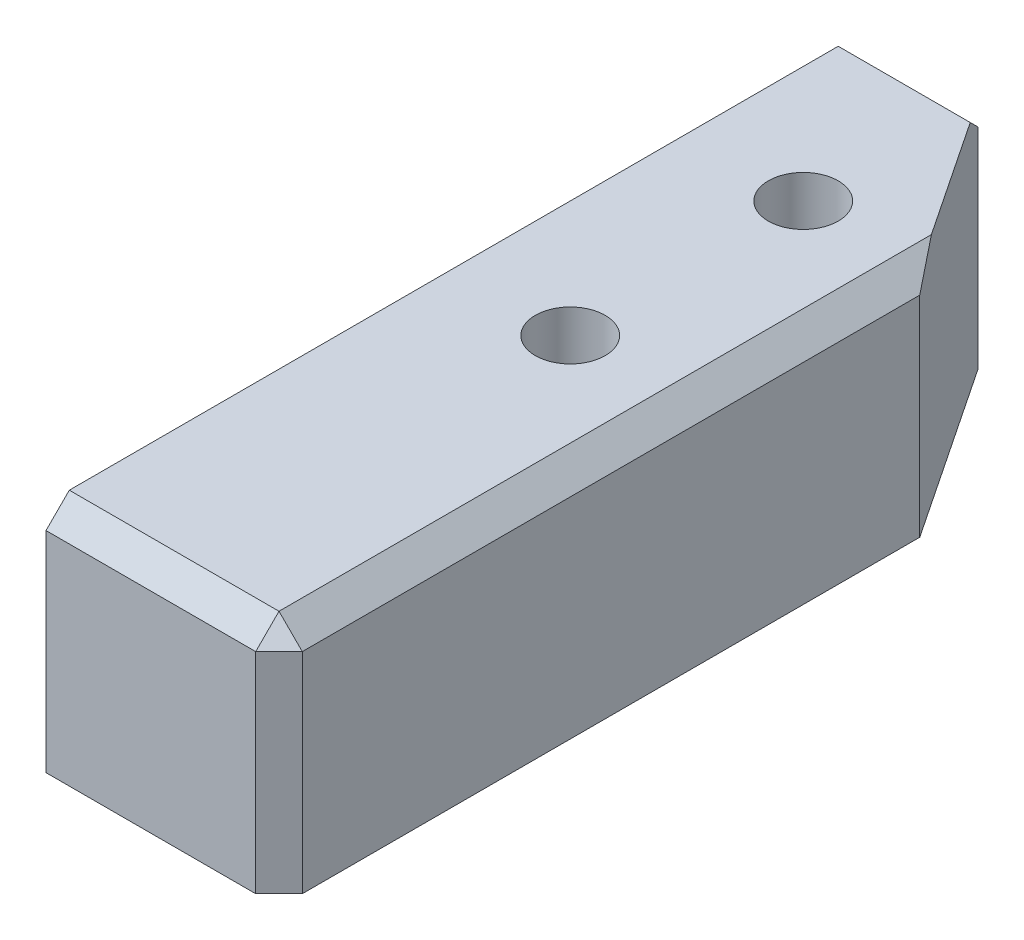
ISO-10303-21;
HEADER;
FILE_DESCRIPTION(('STEP AP214'),'2;1');
FILE_NAME('part.step','',(''),(''),'','','');
FILE_SCHEMA(('AUTOMOTIVE_DESIGN { 1 0 10303 214 1 1 1 1 }'));
ENDSEC;
DATA;
#1=APPLICATION_CONTEXT('core data for automotive mechanical design processes');
#2=APPLICATION_PROTOCOL_DEFINITION('international standard','automotive_design',2000,#1);
#3=PRODUCT_CONTEXT('',#1,'mechanical');
#4=PRODUCT('Part','Part','',(#3));
#5=PRODUCT_RELATED_PRODUCT_CATEGORY('part','',(#4));
#6=PRODUCT_DEFINITION_FORMATION('','',#4);
#7=PRODUCT_DEFINITION_CONTEXT('part definition',#1,'design');
#8=PRODUCT_DEFINITION('design','',#6,#7);
#9=PRODUCT_DEFINITION_SHAPE('','',#8);
#10=(LENGTH_UNIT() NAMED_UNIT(*) SI_UNIT(.MILLI.,.METRE.));
#11=(NAMED_UNIT(*) PLANE_ANGLE_UNIT() SI_UNIT($,.RADIAN.));
#12=(NAMED_UNIT(*) SI_UNIT($,.STERADIAN.) SOLID_ANGLE_UNIT());
#13=UNCERTAINTY_MEASURE_WITH_UNIT(LENGTH_MEASURE(1.E-05),#10,'distance_accuracy_value','');
#14=(GEOMETRIC_REPRESENTATION_CONTEXT(3) GLOBAL_UNCERTAINTY_ASSIGNED_CONTEXT((#13)) GLOBAL_UNIT_ASSIGNED_CONTEXT((#10,
#11,#12)) REPRESENTATION_CONTEXT('',''));
#15=CARTESIAN_POINT('',(0.,0.,0.));
#16=DIRECTION('',(0.,0.,1.));
#17=DIRECTION('',(1.,0.,0.));
#18=AXIS2_PLACEMENT_3D('',#15,#16,#17);
#19=CARTESIAN_POINT('',(-5.,10.,22.5));
#20=DIRECTION('',(1.,0.,0.));
#21=DIRECTION('',(0.,0.,-1.));
#22=AXIS2_PLACEMENT_3D('',#19,#20,#21);
#23=PLANE('',#22);
#24=DIRECTION('',(0.,0.,1.));
#25=VECTOR('',#24,1.);
#26=CARTESIAN_POINT('',(-5.,10.,22.5));
#27=LINE('',#26,#25);
#28=CARTESIAN_POINT('',(-5.,10.,-11.5));
#29=VERTEX_POINT('',#28);
#30=CARTESIAN_POINT('',(-5.,10.,21.5));
#31=VERTEX_POINT('',#30);
#32=EDGE_CURVE('E135',#29,#31,#27,.T.);
#33=ORIENTED_EDGE('',*,*,#32,.F.);
#34=DIRECTION('',(0.,-0.707106781186548,-0.707106781186548));
#35=VECTOR('',#34,1.);
#36=CARTESIAN_POINT('',(-5.,10.,-11.5));
#37=LINE('',#36,#35);
#38=CARTESIAN_POINT('',(-5.,9.,-12.5));
#39=VERTEX_POINT('',#38);
#40=EDGE_CURVE('E165',#29,#39,#37,.T.);
#41=ORIENTED_EDGE('',*,*,#40,.T.);
#42=DIRECTION('',(0.,-1.,0.));
#43=VECTOR('',#42,1.);
#44=CARTESIAN_POINT('',(-5.,10.,-12.5));
#45=LINE('',#44,#43);
#46=CARTESIAN_POINT('',(-5.,0.,-12.5));
#47=VERTEX_POINT('',#46);
#48=EDGE_CURVE('E141',#39,#47,#45,.T.);
#49=ORIENTED_EDGE('',*,*,#48,.T.);
#50=DIRECTION('',(0.,0.,1.));
#51=VECTOR('',#50,1.);
#52=CARTESIAN_POINT('',(-5.,0.,22.5));
#53=LINE('',#52,#51);
#54=CARTESIAN_POINT('',(-5.,0.,22.5));
#55=VERTEX_POINT('',#54);
#56=EDGE_CURVE('E133',#47,#55,#53,.T.);
#57=ORIENTED_EDGE('',*,*,#56,.T.);
#58=DIRECTION('',(0.,-1.,0.));
#59=VECTOR('',#58,1.);
#60=CARTESIAN_POINT('',(-5.,10.,22.5));
#61=LINE('',#60,#59);
#62=CARTESIAN_POINT('',(-5.,8.99999999999999,22.5));
#63=VERTEX_POINT('',#62);
#64=EDGE_CURVE('E149',#63,#55,#61,.T.);
#65=ORIENTED_EDGE('',*,*,#64,.F.);
#66=DIRECTION('',(0.,0.707106781186549,-0.707106781186546));
#67=VECTOR('',#66,1.);
#68=CARTESIAN_POINT('',(-5.,10.,21.5));
#69=LINE('',#68,#67);
#70=EDGE_CURVE('E162',#63,#31,#69,.T.);
#71=ORIENTED_EDGE('',*,*,#70,.T.);
#72=EDGE_LOOP('',(#33,#41,#49,#57,#65,#71));
#73=FACE_BOUND('',#72,.T.);
#74=ADVANCED_FACE('F39',(#73),#23,.F.);
#75=CARTESIAN_POINT('',(5.,10.,22.5));
#76=DIRECTION('',(0.,0.,-1.));
#77=DIRECTION('',(-1.,0.,0.));
#78=AXIS2_PLACEMENT_3D('',#75,#76,#77);
#79=PLANE('',#78);
#80=DIRECTION('',(1.,0.,0.));
#81=VECTOR('',#80,1.);
#82=CARTESIAN_POINT('',(5.,0.,22.5));
#83=LINE('',#82,#81);
#84=CARTESIAN_POINT('',(3.99999999999999,0.,22.5));
#85=VERTEX_POINT('',#84);
#86=EDGE_CURVE('E143',#55,#85,#83,.T.);
#87=ORIENTED_EDGE('',*,*,#86,.T.);
#88=DIRECTION('',(0.,1.,0.));
#89=VECTOR('',#88,1.);
#90=CARTESIAN_POINT('',(3.99999999999999,10.,22.5));
#91=LINE('',#90,#89);
#92=CARTESIAN_POINT('',(3.99999999999999,8.99999999999999,22.5));
#93=VERTEX_POINT('',#92);
#94=EDGE_CURVE('E11',#85,#93,#91,.T.);
#95=ORIENTED_EDGE('',*,*,#94,.T.);
#96=DIRECTION('',(-1.,0.,0.));
#97=VECTOR('',#96,1.);
#98=CARTESIAN_POINT('',(-5.,8.99999999999999,22.5));
#99=LINE('',#98,#97);
#100=EDGE_CURVE('E49',#93,#63,#99,.T.);
#101=ORIENTED_EDGE('',*,*,#100,.T.);
#102=ORIENTED_EDGE('',*,*,#64,.T.);
#103=EDGE_LOOP('',(#87,#95,#101,#102));
#104=FACE_BOUND('',#103,.T.);
#105=ADVANCED_FACE('F225',(#104),#79,.F.);
#106=CARTESIAN_POINT('',(5.,10.,22.5));
#107=DIRECTION('',(-1.,0.,0.));
#108=DIRECTION('',(0.,0.,1.));
#109=AXIS2_PLACEMENT_3D('',#106,#107,#108);
#110=PLANE('',#109);
#111=DIRECTION('',(0.,0.,1.));
#112=VECTOR('',#111,1.);
#113=CARTESIAN_POINT('',(5.,8.99999999999999,22.5));
#114=LINE('',#113,#112);
#115=CARTESIAN_POINT('',(5.,8.99999999999999,-5.));
#116=VERTEX_POINT('',#115);
#117=CARTESIAN_POINT('',(5.,8.99999999999999,21.5));
#118=VERTEX_POINT('',#117);
#119=EDGE_CURVE('E176',#116,#118,#114,.T.);
#120=ORIENTED_EDGE('',*,*,#119,.T.);
#121=DIRECTION('',(0.,-1.,0.));
#122=VECTOR('',#121,1.);
#123=CARTESIAN_POINT('',(5.,10.,21.5));
#124=LINE('',#123,#122);
#125=CARTESIAN_POINT('',(5.,0.,21.5));
#126=VERTEX_POINT('',#125);
#127=EDGE_CURVE('E179',#118,#126,#124,.T.);
#128=ORIENTED_EDGE('',*,*,#127,.T.);
#129=DIRECTION('',(0.,0.,-1.));
#130=VECTOR('',#129,1.);
#131=CARTESIAN_POINT('',(5.,0.,22.5));
#132=LINE('',#131,#130);
#133=CARTESIAN_POINT('',(5.,0.,-5.00000000000001));
#134=VERTEX_POINT('',#133);
#135=EDGE_CURVE('E136',#126,#134,#132,.T.);
#136=ORIENTED_EDGE('',*,*,#135,.T.);
#137=DIRECTION('',(0.,1.,0.));
#138=VECTOR('',#137,1.);
#139=CARTESIAN_POINT('',(5.,0.,-5.));
#140=LINE('',#139,#138);
#141=EDGE_CURVE('E116',#134,#116,#140,.T.);
#142=ORIENTED_EDGE('',*,*,#141,.T.);
#143=EDGE_LOOP('',(#120,#128,#136,#142));
#144=FACE_BOUND('',#143,.T.);
#145=ADVANCED_FACE('F246',(#144),#110,.F.);
#146=CARTESIAN_POINT('',(5.,10.,-12.5));
#147=DIRECTION('',(0.,0.,1.));
#148=DIRECTION('',(1.,0.,0.));
#149=AXIS2_PLACEMENT_3D('',#146,#147,#148);
#150=PLANE('',#149);
#151=ORIENTED_EDGE('',*,*,#48,.F.);
#152=DIRECTION('',(1.,0.,0.));
#153=VECTOR('',#152,1.);
#154=CARTESIAN_POINT('',(0.,9.,-12.5));
#155=LINE('',#154,#153);
#156=CARTESIAN_POINT('',(0.,9.,-12.5));
#157=VERTEX_POINT('',#156);
#158=EDGE_CURVE('E128',#39,#157,#155,.T.);
#159=ORIENTED_EDGE('',*,*,#158,.T.);
#160=DIRECTION('',(0.,1.,0.));
#161=VECTOR('',#160,1.);
#162=CARTESIAN_POINT('',(0.,0.,-12.5));
#163=LINE('',#162,#161);
#164=CARTESIAN_POINT('',(0.,0.,-12.5));
#165=VERTEX_POINT('',#164);
#166=EDGE_CURVE('E113',#165,#157,#163,.T.);
#167=ORIENTED_EDGE('',*,*,#166,.F.);
#168=DIRECTION('',(-1.,0.,0.));
#169=VECTOR('',#168,1.);
#170=CARTESIAN_POINT('',(5.,0.,-12.5));
#171=LINE('',#170,#169);
#172=EDGE_CURVE('E125',#165,#47,#171,.T.);
#173=ORIENTED_EDGE('',*,*,#172,.T.);
#174=EDGE_LOOP('',(#151,#159,#167,#173));
#175=FACE_BOUND('',#174,.T.);
#176=ADVANCED_FACE('F124',(#175),#150,.F.);
#177=CARTESIAN_POINT('',(0.,10.,0.));
#178=DIRECTION('',(0.,1.,0.));
#179=DIRECTION('',(0.,0.,1.));
#180=AXIS2_PLACEMENT_3D('',#177,#178,#179);
#181=PLANE('',#180);
#182=DIRECTION('',(0.554700196225229,0.,0.832050294337844));
#183=VECTOR('',#182,1.);
#184=CARTESIAN_POINT('',(0.,10.,-12.5));
#185=LINE('',#184,#183);
#186=CARTESIAN_POINT('',(0.666666666666669,10.,-11.5));
#187=VERTEX_POINT('',#186);
#188=CARTESIAN_POINT('',(4.,10.,-6.50000000000001));
#189=VERTEX_POINT('',#188);
#190=EDGE_CURVE('E119',#187,#189,#185,.T.);
#191=ORIENTED_EDGE('',*,*,#190,.F.);
#192=DIRECTION('',(-1.,0.,0.));
#193=VECTOR('',#192,1.);
#194=CARTESIAN_POINT('',(-5.,10.,-11.5));
#195=LINE('',#194,#193);
#196=EDGE_CURVE('E158',#187,#29,#195,.T.);
#197=ORIENTED_EDGE('',*,*,#196,.T.);
#198=ORIENTED_EDGE('',*,*,#32,.T.);
#199=DIRECTION('',(1.,0.,0.));
#200=VECTOR('',#199,1.);
#201=CARTESIAN_POINT('',(5.,10.,21.5));
#202=LINE('',#201,#200);
#203=CARTESIAN_POINT('',(4.,10.,21.5));
#204=VERTEX_POINT('',#203);
#205=EDGE_CURVE('E152',#31,#204,#202,.T.);
#206=ORIENTED_EDGE('',*,*,#205,.T.);
#207=DIRECTION('',(0.,0.,-1.));
#208=VECTOR('',#207,1.);
#209=CARTESIAN_POINT('',(4.,10.,-5.));
#210=LINE('',#209,#208);
#211=EDGE_CURVE('E155',#204,#189,#210,.T.);
#212=ORIENTED_EDGE('',*,*,#211,.T.);
#213=EDGE_LOOP('',(#191,#197,#198,#206,#212));
#214=FACE_BOUND('',#213,.T.);
#215=CARTESIAN_POINT('',(0.,10.,-5.));
#216=DIRECTION('',(0.,1.,0.));
#217=DIRECTION('',(0.,0.,1.));
#218=AXIS2_PLACEMENT_3D('',#215,#216,#217);
#219=CIRCLE('',#218,1.5);
#220=CARTESIAN_POINT('',(0.,10.,-3.5));
#221=VERTEX_POINT('',#220);
#222=EDGE_CURVE('E212',#221,#221,#219,.T.);
#223=ORIENTED_EDGE('',*,*,#222,.F.);
#224=EDGE_LOOP('',(#223));
#225=FACE_BOUND('',#224,.T.);
#226=CARTESIAN_POINT('',(0.,10.,5.));
#227=DIRECTION('',(0.,1.,0.));
#228=DIRECTION('',(0.,0.,1.));
#229=AXIS2_PLACEMENT_3D('',#226,#227,#228);
#230=CIRCLE('',#229,1.5);
#231=CARTESIAN_POINT('',(0.,10.,6.5));
#232=VERTEX_POINT('',#231);
#233=EDGE_CURVE('E206',#232,#232,#230,.T.);
#234=ORIENTED_EDGE('',*,*,#233,.F.);
#235=EDGE_LOOP('',(#234));
#236=FACE_BOUND('',#235,.T.);
#237=ADVANCED_FACE('F263',(#214,#225,#236),#181,.T.);
#238=CARTESIAN_POINT('',(0.,0.,0.));
#239=DIRECTION('',(0.,1.,0.));
#240=DIRECTION('',(0.,0.,1.));
#241=AXIS2_PLACEMENT_3D('',#238,#239,#240);
#242=PLANE('',#241);
#243=CARTESIAN_POINT('',(0.,0.,-5.));
#244=DIRECTION('',(0.,1.,0.));
#245=DIRECTION('',(0.,0.,1.));
#246=AXIS2_PLACEMENT_3D('',#243,#244,#245);
#247=CIRCLE('',#246,1.5);
#248=CARTESIAN_POINT('',(0.,0.,-3.5));
#249=VERTEX_POINT('',#248);
#250=EDGE_CURVE('E208',#249,#249,#247,.T.);
#251=ORIENTED_EDGE('',*,*,#250,.T.);
#252=EDGE_LOOP('',(#251));
#253=FACE_BOUND('',#252,.T.);
#254=CARTESIAN_POINT('',(0.,0.,5.));
#255=DIRECTION('',(0.,1.,0.));
#256=DIRECTION('',(0.,0.,1.));
#257=AXIS2_PLACEMENT_3D('',#254,#255,#256);
#258=CIRCLE('',#257,1.5);
#259=CARTESIAN_POINT('',(0.,0.,6.5));
#260=VERTEX_POINT('',#259);
#261=EDGE_CURVE('E216',#260,#260,#258,.T.);
#262=ORIENTED_EDGE('',*,*,#261,.T.);
#263=EDGE_LOOP('',(#262));
#264=FACE_BOUND('',#263,.T.);
#265=ORIENTED_EDGE('',*,*,#135,.F.);
#266=DIRECTION('',(0.707106781186549,0.,-0.707106781186546));
#267=VECTOR('',#266,1.);
#268=CARTESIAN_POINT('',(5.,0.,21.5));
#269=LINE('',#268,#267);
#270=EDGE_CURVE('E63',#126,#85,#269,.F.);
#271=ORIENTED_EDGE('',*,*,#270,.T.);
#272=ORIENTED_EDGE('',*,*,#86,.F.);
#273=ORIENTED_EDGE('',*,*,#56,.F.);
#274=ORIENTED_EDGE('',*,*,#172,.F.);
#275=DIRECTION('',(0.554700196225229,0.,0.832050294337844));
#276=VECTOR('',#275,1.);
#277=CARTESIAN_POINT('',(0.,0.,-12.5));
#278=LINE('',#277,#276);
#279=EDGE_CURVE('E110',#165,#134,#278,.T.);
#280=ORIENTED_EDGE('',*,*,#279,.T.);
#281=EDGE_LOOP('',(#265,#271,#272,#273,#274,#280));
#282=FACE_BOUND('',#281,.T.);
#283=ADVANCED_FACE('F131',(#253,#264,#282),#242,.F.);
#284=CARTESIAN_POINT('',(0.,0.,5.));
#285=DIRECTION('',(0.,1.,0.));
#286=DIRECTION('',(0.,0.,1.));
#287=AXIS2_PLACEMENT_3D('',#284,#285,#286);
#288=CYLINDRICAL_SURFACE('',#287,1.5);
#289=ORIENTED_EDGE('',*,*,#261,.F.);
#290=EDGE_LOOP('',(#289));
#291=FACE_BOUND('',#290,.T.);
#292=ORIENTED_EDGE('',*,*,#233,.T.);
#293=EDGE_LOOP('',(#292));
#294=FACE_BOUND('',#293,.T.);
#295=ADVANCED_FACE('F278',(#291,#294),#288,.F.);
#296=CARTESIAN_POINT('',(0.,0.,-5.));
#297=DIRECTION('',(0.,1.,0.));
#298=DIRECTION('',(0.,0.,1.));
#299=AXIS2_PLACEMENT_3D('',#296,#297,#298);
#300=CYLINDRICAL_SURFACE('',#299,1.5);
#301=ORIENTED_EDGE('',*,*,#250,.F.);
#302=EDGE_LOOP('',(#301));
#303=FACE_BOUND('',#302,.T.);
#304=ORIENTED_EDGE('',*,*,#222,.T.);
#305=EDGE_LOOP('',(#304));
#306=FACE_BOUND('',#305,.T.);
#307=ADVANCED_FACE('F259',(#303,#306),#300,.F.);
#308=CARTESIAN_POINT('',(0.,0.,-12.5));
#309=DIRECTION('',(-0.832050294337844,0.,0.554700196225229));
#310=DIRECTION('',(0.554700196225229,0.,0.832050294337844));
#311=AXIS2_PLACEMENT_3D('',#308,#309,#310);
#312=PLANE('',#311);
#313=ORIENTED_EDGE('',*,*,#166,.T.);
#314=DIRECTION('',(0.426401432711221,0.639602149066831,0.639602149066831));
#315=VECTOR('',#314,1.);
#316=CARTESIAN_POINT('',(0.545454545454547,9.81818181818182,-11.6818181818182));
#317=LINE('',#316,#315);
#318=EDGE_CURVE('E173',#157,#187,#317,.T.);
#319=ORIENTED_EDGE('',*,*,#318,.T.);
#320=ORIENTED_EDGE('',*,*,#190,.T.);
#321=DIRECTION('',(0.485071250072666,-0.485071250072667,0.727606875108998));
#322=VECTOR('',#321,1.);
#323=CARTESIAN_POINT('',(6.29411764705882,7.70588235294117,-3.05882352941178));
#324=LINE('',#323,#322);
#325=EDGE_CURVE('E170',#189,#116,#324,.T.);
#326=ORIENTED_EDGE('',*,*,#325,.T.);
#327=ORIENTED_EDGE('',*,*,#141,.F.);
#328=ORIENTED_EDGE('',*,*,#279,.F.);
#329=EDGE_LOOP('',(#313,#319,#320,#326,#327,#328));
#330=FACE_BOUND('',#329,.T.);
#331=ADVANCED_FACE('F112',(#330),#312,.F.);
#332=CARTESIAN_POINT('',(0.,10.,-11.5));
#333=DIRECTION('',(0.,0.707106781186547,-0.707106781186547));
#334=DIRECTION('',(1.,0.,0.));
#335=AXIS2_PLACEMENT_3D('',#332,#333,#334);
#336=PLANE('',#335);
#337=ORIENTED_EDGE('',*,*,#318,.F.);
#338=ORIENTED_EDGE('',*,*,#158,.F.);
#339=ORIENTED_EDGE('',*,*,#40,.F.);
#340=ORIENTED_EDGE('',*,*,#196,.F.);
#341=EDGE_LOOP('',(#337,#338,#339,#340));
#342=FACE_BOUND('',#341,.T.);
#343=ADVANCED_FACE('F251',(#342),#336,.T.);
#344=CARTESIAN_POINT('',(0.,10.,21.5));
#345=DIRECTION('',(0.,0.707106781186546,0.707106781186549));
#346=DIRECTION('',(-1.,0.,0.));
#347=AXIS2_PLACEMENT_3D('',#344,#345,#346);
#348=PLANE('',#347);
#349=ORIENTED_EDGE('',*,*,#70,.F.);
#350=ORIENTED_EDGE('',*,*,#100,.F.);
#351=DIRECTION('',(0.,-0.707106781186549,0.707106781186546));
#352=VECTOR('',#351,1.);
#353=CARTESIAN_POINT('',(3.99999999999999,8.99999999999999,22.5));
#354=LINE('',#353,#352);
#355=EDGE_CURVE('E43',#204,#93,#354,.T.);
#356=ORIENTED_EDGE('',*,*,#355,.F.);
#357=ORIENTED_EDGE('',*,*,#205,.F.);
#358=EDGE_LOOP('',(#349,#350,#356,#357));
#359=FACE_BOUND('',#358,.T.);
#360=ADVANCED_FACE('F41',(#359),#348,.T.);
#361=CARTESIAN_POINT('',(4.,10.,0.));
#362=DIRECTION('',(0.707106781186549,0.707106781186546,0.));
#363=DIRECTION('',(0.,0.,1.));
#364=AXIS2_PLACEMENT_3D('',#361,#362,#363);
#365=PLANE('',#364);
#366=ORIENTED_EDGE('',*,*,#325,.F.);
#367=ORIENTED_EDGE('',*,*,#211,.F.);
#368=DIRECTION('',(-0.707106781186546,0.707106781186549,0.));
#369=VECTOR('',#368,1.);
#370=CARTESIAN_POINT('',(4.5,9.5,21.5));
#371=LINE('',#370,#369);
#372=EDGE_CURVE('E190',#118,#204,#371,.T.);
#373=ORIENTED_EDGE('',*,*,#372,.F.);
#374=ORIENTED_EDGE('',*,*,#119,.F.);
#375=EDGE_LOOP('',(#366,#367,#373,#374));
#376=FACE_BOUND('',#375,.T.);
#377=ADVANCED_FACE('F232',(#376),#365,.T.);
#378=CARTESIAN_POINT('',(3.99999999999999,8.99999999999999,22.5));
#379=DIRECTION('',(0.577350269189626,0.577350269189624,0.577350269189628));
#380=DIRECTION('',(0.707106781186549,0.,-0.707106781186546));
#381=AXIS2_PLACEMENT_3D('',#378,#379,#380);
#382=PLANE('',#381);
#383=ORIENTED_EDGE('',*,*,#372,.T.);
#384=ORIENTED_EDGE('',*,*,#355,.T.);
#385=DIRECTION('',(-0.707106781186549,0.,0.707106781186546));
#386=VECTOR('',#385,1.);
#387=CARTESIAN_POINT('',(3.99999999999999,8.99999999999999,22.5));
#388=LINE('',#387,#386);
#389=EDGE_CURVE('E187',#118,#93,#388,.T.);
#390=ORIENTED_EDGE('',*,*,#389,.F.);
#391=EDGE_LOOP('',(#383,#384,#390));
#392=FACE_BOUND('',#391,.T.);
#393=ADVANCED_FACE('F230',(#392),#382,.T.);
#394=CARTESIAN_POINT('',(5.,10.,21.5));
#395=DIRECTION('',(-0.707106781186546,0.,-0.707106781186549));
#396=DIRECTION('',(0.,-1.,0.));
#397=AXIS2_PLACEMENT_3D('',#394,#395,#396);
#398=PLANE('',#397);
#399=ORIENTED_EDGE('',*,*,#389,.T.);
#400=ORIENTED_EDGE('',*,*,#94,.F.);
#401=ORIENTED_EDGE('',*,*,#270,.F.);
#402=ORIENTED_EDGE('',*,*,#127,.F.);
#403=EDGE_LOOP('',(#399,#400,#401,#402));
#404=FACE_BOUND('',#403,.T.);
#405=ADVANCED_FACE('F228',(#404),#398,.F.);
#406=CLOSED_SHELL('',(#74,#105,#145,#176,#237,#283,#295,#307,#331,#343,#360,#377,#393,#405));
#407=MANIFOLD_SOLID_BREP('B2',#406);
#408=ADVANCED_BREP_SHAPE_REPRESENTATION('',(#18,#407),#14);
#409=SHAPE_DEFINITION_REPRESENTATION(#9,#408);
ENDSEC;
END-ISO-10303-21;
